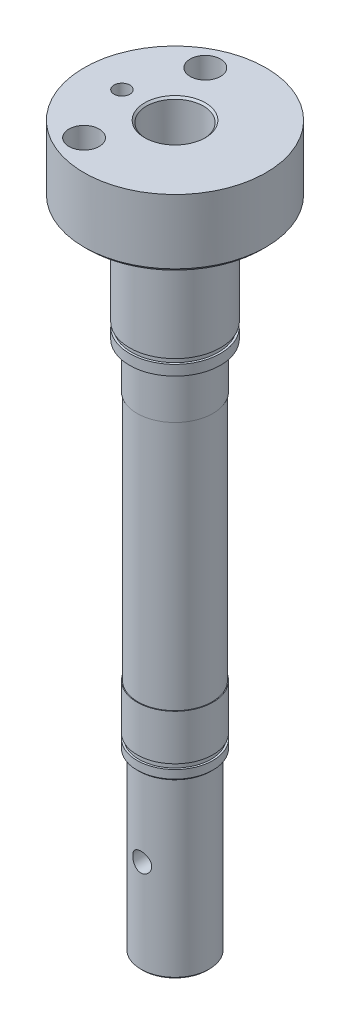
ISO-10303-21;
HEADER;
FILE_DESCRIPTION(('STEP AP214'),'2;1');
FILE_NAME('part.step','',(''),(''),'','','');
FILE_SCHEMA(('AUTOMOTIVE_DESIGN { 1 0 10303 214 1 1 1 1 }'));
ENDSEC;
DATA;
#1=APPLICATION_CONTEXT('core data for automotive mechanical design processes');
#2=APPLICATION_PROTOCOL_DEFINITION('international standard','automotive_design',2000,#1);
#3=PRODUCT_CONTEXT('',#1,'mechanical');
#4=PRODUCT('Part','Part','',(#3));
#5=PRODUCT_RELATED_PRODUCT_CATEGORY('part','',(#4));
#6=PRODUCT_DEFINITION_FORMATION('','',#4);
#7=PRODUCT_DEFINITION_CONTEXT('part definition',#1,'design');
#8=PRODUCT_DEFINITION('design','',#6,#7);
#9=PRODUCT_DEFINITION_SHAPE('','',#8);
#10=(LENGTH_UNIT() NAMED_UNIT(*) SI_UNIT(.MILLI.,.METRE.));
#11=(NAMED_UNIT(*) PLANE_ANGLE_UNIT() SI_UNIT($,.RADIAN.));
#12=(NAMED_UNIT(*) SI_UNIT($,.STERADIAN.) SOLID_ANGLE_UNIT());
#13=UNCERTAINTY_MEASURE_WITH_UNIT(LENGTH_MEASURE(1.E-05),#10,'distance_accuracy_value','');
#14=(GEOMETRIC_REPRESENTATION_CONTEXT(3) GLOBAL_UNCERTAINTY_ASSIGNED_CONTEXT((#13)) GLOBAL_UNIT_ASSIGNED_CONTEXT((#10,
#11,#12)) REPRESENTATION_CONTEXT('',''));
#15=CARTESIAN_POINT('',(0.,0.,0.));
#16=DIRECTION('',(0.,0.,1.));
#17=DIRECTION('',(1.,0.,0.));
#18=AXIS2_PLACEMENT_3D('',#15,#16,#17);
#19=CARTESIAN_POINT('',(0.,0.,0.));
#20=DIRECTION('',(0.,-1.,0.));
#21=DIRECTION('',(0.,0.,-1.));
#22=AXIS2_PLACEMENT_3D('',#19,#20,#21);
#23=CYLINDRICAL_SURFACE('',#22,9.99999999999998);
#24=CARTESIAN_POINT('',(0.,50.,0.));
#25=DIRECTION('',(0.,-1.,0.));
#26=DIRECTION('',(0.,0.,-1.));
#27=AXIS2_PLACEMENT_3D('',#24,#25,#26);
#28=CIRCLE('',#27,10.);
#29=CARTESIAN_POINT('',(0.,50.,-10.));
#30=VERTEX_POINT('',#29);
#31=EDGE_CURVE('E129',#30,#30,#28,.T.);
#32=ORIENTED_EDGE('',*,*,#31,.F.);
#33=EDGE_LOOP('',(#32));
#34=FACE_BOUND('',#33,.T.);
#35=CARTESIAN_POINT('',(0.,62.,0.));
#36=DIRECTION('',(0.,-1.,0.));
#37=DIRECTION('',(0.,0.,-1.));
#38=AXIS2_PLACEMENT_3D('',#35,#36,#37);
#39=CIRCLE('',#38,9.99999999999998);
#40=CARTESIAN_POINT('',(0.,62.,-9.99999999999998));
#41=VERTEX_POINT('',#40);
#42=EDGE_CURVE('E147',#41,#41,#39,.T.);
#43=ORIENTED_EDGE('',*,*,#42,.T.);
#44=EDGE_LOOP('',(#43));
#45=FACE_BOUND('',#44,.T.);
#46=ADVANCED_FACE('F36',(#34,#45),#23,.T.);
#47=CARTESIAN_POINT('',(0.,0.,0.));
#48=DIRECTION('',(0.,-1.,0.));
#49=DIRECTION('',(0.,0.,-1.));
#50=AXIS2_PLACEMENT_3D('',#47,#48,#49);
#51=CYLINDRICAL_SURFACE('',#50,12.);
#52=CARTESIAN_POINT('',(0.,140.,0.));
#53=DIRECTION('',(0.,-1.,0.));
#54=DIRECTION('',(0.,0.,-1.));
#55=AXIS2_PLACEMENT_3D('',#52,#53,#54);
#56=CIRCLE('',#55,12.);
#57=CARTESIAN_POINT('',(-11.9853571428572,140.,-0.592633240852343));
#58=VERTEX_POINT('',#57);
#59=CARTESIAN_POINT('',(-11.9853571428572,140.,0.592633240852342));
#60=VERTEX_POINT('',#59);
#61=EDGE_CURVE('E162',#58,#60,#56,.T.);
#62=ORIENTED_EDGE('',*,*,#61,.F.);
#63=DIRECTION('',(0.,1.,0.));
#64=VECTOR('',#63,1.);
#65=CARTESIAN_POINT('',(-11.9853571428572,141.35,-0.592633240852343));
#66=LINE('',#65,#64);
#67=CARTESIAN_POINT('',(-11.9853571428571,142.7,-0.592633240852343));
#68=VERTEX_POINT('',#67);
#69=EDGE_CURVE('E100',#58,#68,#66,.T.);
#70=ORIENTED_EDGE('',*,*,#69,.T.);
#71=CARTESIAN_POINT('',(0.,142.7,0.));
#72=DIRECTION('',(0.,-1.,0.));
#73=DIRECTION('',(0.,0.,-1.));
#74=AXIS2_PLACEMENT_3D('',#71,#72,#73);
#75=CIRCLE('',#74,12.);
#76=CARTESIAN_POINT('',(-11.9853571428571,142.7,0.592633240852343));
#77=VERTEX_POINT('',#76);
#78=EDGE_CURVE('E141',#68,#77,#75,.T.);
#79=ORIENTED_EDGE('',*,*,#78,.T.);
#80=DIRECTION('',(0.,1.,0.));
#81=VECTOR('',#80,1.);
#82=CARTESIAN_POINT('',(-11.9853571428572,141.35,0.592633240852342));
#83=LINE('',#82,#81);
#84=EDGE_CURVE('E51',#77,#60,#83,.F.);
#85=ORIENTED_EDGE('',*,*,#84,.T.);
#86=EDGE_LOOP('',(#62,#70,#79,#85));
#87=FACE_BOUND('',#86,.T.);
#88=ADVANCED_FACE('F234',(#87),#51,.T.);
#89=CARTESIAN_POINT('',(12.,140.,0.));
#90=DIRECTION('',(0.,1.,0.));
#91=DIRECTION('',(0.,0.,1.));
#92=AXIS2_PLACEMENT_3D('',#89,#90,#91);
#93=PLANE('',#92);
#94=CARTESIAN_POINT('',(0.,140.,0.));
#95=DIRECTION('',(0.,-1.,0.));
#96=DIRECTION('',(0.,0.,-1.));
#97=AXIS2_PLACEMENT_3D('',#94,#95,#96);
#98=CIRCLE('',#97,9.99999999999999);
#99=CARTESIAN_POINT('',(0.,140.,-9.99999999999999));
#100=VERTEX_POINT('',#99);
#101=EDGE_CURVE('E159',#100,#100,#98,.T.);
#102=ORIENTED_EDGE('',*,*,#101,.F.);
#103=EDGE_LOOP('',(#102));
#104=FACE_BOUND('',#103,.T.);
#105=ORIENTED_EDGE('',*,*,#61,.T.);
#106=CARTESIAN_POINT('',(-14.,140.,0.));
#107=DIRECTION('',(0.,1.,0.));
#108=DIRECTION('',(0.,0.,1.));
#109=AXIS2_PLACEMENT_3D('',#106,#107,#108);
#110=CIRCLE('',#109,2.09999999999997);
#111=EDGE_CURVE('E103',#60,#58,#110,.T.);
#112=ORIENTED_EDGE('',*,*,#111,.T.);
#113=EDGE_LOOP('',(#105,#112));
#114=FACE_BOUND('',#113,.T.);
#115=ADVANCED_FACE('F240',(#104,#114),#93,.F.);
#116=CARTESIAN_POINT('',(0.,0.,0.));
#117=DIRECTION('',(0.,-1.,0.));
#118=DIRECTION('',(0.,0.,-1.));
#119=AXIS2_PLACEMENT_3D('',#116,#117,#118);
#120=CYLINDRICAL_SURFACE('',#119,9.99999999999999);
#121=CARTESIAN_POINT('',(0.,128.,0.));
#122=DIRECTION('',(0.,-1.,0.));
#123=DIRECTION('',(0.,0.,-1.));
#124=AXIS2_PLACEMENT_3D('',#121,#122,#123);
#125=CIRCLE('',#124,9.99999999999999);
#126=CARTESIAN_POINT('',(0.,128.,-9.99999999999999));
#127=VERTEX_POINT('',#126);
#128=EDGE_CURVE('E156',#127,#127,#125,.T.);
#129=ORIENTED_EDGE('',*,*,#128,.F.);
#130=EDGE_LOOP('',(#129));
#131=FACE_BOUND('',#130,.T.);
#132=ORIENTED_EDGE('',*,*,#101,.T.);
#133=EDGE_LOOP('',(#132));
#134=FACE_BOUND('',#133,.T.);
#135=ADVANCED_FACE('F393',(#131,#134),#120,.T.);
#136=CARTESIAN_POINT('',(9.99999999999999,128.,0.));
#137=DIRECTION('',(0.,1.,0.));
#138=DIRECTION('',(0.,0.,1.));
#139=AXIS2_PLACEMENT_3D('',#136,#137,#138);
#140=PLANE('',#139);
#141=CARTESIAN_POINT('',(0.,128.,0.));
#142=DIRECTION('',(0.,-1.,0.));
#143=DIRECTION('',(0.,0.,-1.));
#144=AXIS2_PLACEMENT_3D('',#141,#142,#143);
#145=CIRCLE('',#144,9.79999999999999);
#146=CARTESIAN_POINT('',(0.,128.,-9.79999999999999));
#147=VERTEX_POINT('',#146);
#148=EDGE_CURVE('E153',#147,#147,#145,.T.);
#149=ORIENTED_EDGE('',*,*,#148,.F.);
#150=EDGE_LOOP('',(#149));
#151=FACE_BOUND('',#150,.T.);
#152=ORIENTED_EDGE('',*,*,#128,.T.);
#153=EDGE_LOOP('',(#152));
#154=FACE_BOUND('',#153,.T.);
#155=ADVANCED_FACE('F383',(#151,#154),#140,.F.);
#156=CARTESIAN_POINT('',(0.,0.,0.));
#157=DIRECTION('',(0.,-1.,0.));
#158=DIRECTION('',(0.,0.,-1.));
#159=AXIS2_PLACEMENT_3D('',#156,#157,#158);
#160=CYLINDRICAL_SURFACE('',#159,9.79999999999999);
#161=CARTESIAN_POINT('',(0.,62.,0.));
#162=DIRECTION('',(0.,-1.,0.));
#163=DIRECTION('',(0.,0.,-1.));
#164=AXIS2_PLACEMENT_3D('',#161,#162,#163);
#165=CIRCLE('',#164,9.79999999999998);
#166=CARTESIAN_POINT('',(0.,62.,-9.79999999999998));
#167=VERTEX_POINT('',#166);
#168=EDGE_CURVE('E150',#167,#167,#165,.T.);
#169=ORIENTED_EDGE('',*,*,#168,.F.);
#170=EDGE_LOOP('',(#169));
#171=FACE_BOUND('',#170,.T.);
#172=ORIENTED_EDGE('',*,*,#148,.T.);
#173=EDGE_LOOP('',(#172));
#174=FACE_BOUND('',#173,.T.);
#175=ADVANCED_FACE('F375',(#171,#174),#160,.T.);
#176=CARTESIAN_POINT('',(9.79999999999998,62.,0.));
#177=DIRECTION('',(0.,-1.,0.));
#178=DIRECTION('',(0.,0.,-1.));
#179=AXIS2_PLACEMENT_3D('',#176,#177,#178);
#180=PLANE('',#179);
#181=ORIENTED_EDGE('',*,*,#42,.F.);
#182=EDGE_LOOP('',(#181));
#183=FACE_BOUND('',#182,.T.);
#184=ORIENTED_EDGE('',*,*,#168,.T.);
#185=EDGE_LOOP('',(#184));
#186=FACE_BOUND('',#185,.T.);
#187=ADVANCED_FACE('F223',(#183,#186),#180,.F.);
#188=CARTESIAN_POINT('',(12.,142.7,0.));
#189=DIRECTION('',(0.,1.,0.));
#190=DIRECTION('',(0.,0.,1.));
#191=AXIS2_PLACEMENT_3D('',#188,#189,#190);
#192=PLANE('',#191);
#193=CARTESIAN_POINT('',(-14.,142.7,0.));
#194=DIRECTION('',(0.,1.,0.));
#195=DIRECTION('',(0.,0.,1.));
#196=AXIS2_PLACEMENT_3D('',#193,#194,#195);
#197=CIRCLE('',#196,2.09999999999997);
#198=EDGE_CURVE('E97',#77,#68,#197,.T.);
#199=ORIENTED_EDGE('',*,*,#198,.F.);
#200=ORIENTED_EDGE('',*,*,#78,.F.);
#201=EDGE_LOOP('',(#199,#200));
#202=FACE_BOUND('',#201,.T.);
#203=CARTESIAN_POINT('',(0.,142.7,0.));
#204=DIRECTION('',(0.,-1.,0.));
#205=DIRECTION('',(0.,0.,-1.));
#206=AXIS2_PLACEMENT_3D('',#203,#204,#205);
#207=CIRCLE('',#206,11.45);
#208=CARTESIAN_POINT('',(0.,142.7,-11.45));
#209=VERTEX_POINT('',#208);
#210=EDGE_CURVE('E138',#209,#209,#207,.T.);
#211=ORIENTED_EDGE('',*,*,#210,.T.);
#212=EDGE_LOOP('',(#211));
#213=FACE_BOUND('',#212,.T.);
#214=ADVANCED_FACE('F220',(#202,#213),#192,.T.);
#215=CARTESIAN_POINT('',(0.,0.,0.));
#216=DIRECTION('',(0.,-1.,0.));
#217=DIRECTION('',(0.,0.,-1.));
#218=AXIS2_PLACEMENT_3D('',#215,#216,#217);
#219=CYLINDRICAL_SURFACE('',#218,11.45);
#220=ORIENTED_EDGE('',*,*,#210,.F.);
#221=EDGE_LOOP('',(#220));
#222=FACE_BOUND('',#221,.T.);
#223=CARTESIAN_POINT('',(0.,144.,0.));
#224=DIRECTION('',(0.,-1.,0.));
#225=DIRECTION('',(0.,0.,-1.));
#226=AXIS2_PLACEMENT_3D('',#223,#224,#225);
#227=CIRCLE('',#226,11.45);
#228=CARTESIAN_POINT('',(0.,144.,-11.45));
#229=VERTEX_POINT('',#228);
#230=EDGE_CURVE('E135',#229,#229,#227,.T.);
#231=ORIENTED_EDGE('',*,*,#230,.T.);
#232=EDGE_LOOP('',(#231));
#233=FACE_BOUND('',#232,.T.);
#234=ADVANCED_FACE('F216',(#222,#233),#219,.T.);
#235=CARTESIAN_POINT('',(11.45,144.,0.));
#236=DIRECTION('',(0.,-1.,0.));
#237=DIRECTION('',(0.,0.,-1.));
#238=AXIS2_PLACEMENT_3D('',#235,#236,#237);
#239=PLANE('',#238);
#240=CARTESIAN_POINT('',(-14.,144.,0.));
#241=DIRECTION('',(0.,-1.,0.));
#242=DIRECTION('',(0.,0.,-1.));
#243=AXIS2_PLACEMENT_3D('',#240,#241,#242);
#244=CIRCLE('',#243,2.09999999999997);
#245=CARTESIAN_POINT('',(-11.9853571428571,144.,-0.592633240852343));
#246=VERTEX_POINT('',#245);
#247=CARTESIAN_POINT('',(-11.9853571428571,144.,0.592633240852342));
#248=VERTEX_POINT('',#247);
#249=EDGE_CURVE('E59',#246,#248,#244,.T.);
#250=ORIENTED_EDGE('',*,*,#249,.F.);
#251=CARTESIAN_POINT('',(0.,144.,0.));
#252=DIRECTION('',(0.,-1.,0.));
#253=DIRECTION('',(0.,0.,-1.));
#254=AXIS2_PLACEMENT_3D('',#251,#252,#253);
#255=CIRCLE('',#254,12.);
#256=EDGE_CURVE('E132',#246,#248,#255,.T.);
#257=ORIENTED_EDGE('',*,*,#256,.T.);
#258=EDGE_LOOP('',(#250,#257));
#259=FACE_BOUND('',#258,.T.);
#260=ORIENTED_EDGE('',*,*,#230,.F.);
#261=EDGE_LOOP('',(#260));
#262=FACE_BOUND('',#261,.T.);
#263=ADVANCED_FACE('F213',(#259,#262),#239,.T.);
#264=CARTESIAN_POINT('',(0.,190.,0.));
#265=DIRECTION('',(0.,-1.,0.));
#266=DIRECTION('',(0.,0.,-1.));
#267=AXIS2_PLACEMENT_3D('',#264,#265,#266);
#268=PLANE('',#267);
#269=CARTESIAN_POINT('',(0.,190.,0.));
#270=DIRECTION('',(0.,-1.,0.));
#271=DIRECTION('',(0.,0.,-1.));
#272=AXIS2_PLACEMENT_3D('',#269,#270,#271);
#273=CIRCLE('',#272,8.);
#274=CARTESIAN_POINT('',(0.,190.,-8.));
#275=VERTEX_POINT('',#274);
#276=EDGE_CURVE('E11',#275,#275,#273,.T.);
#277=ORIENTED_EDGE('',*,*,#276,.T.);
#278=EDGE_LOOP('',(#277));
#279=FACE_BOUND('',#278,.T.);
#280=CARTESIAN_POINT('',(-14.,190.,0.));
#281=DIRECTION('',(0.,1.,0.));
#282=DIRECTION('',(0.,0.,1.));
#283=AXIS2_PLACEMENT_3D('',#280,#281,#282);
#284=CIRCLE('',#283,2.09999999999998);
#285=CARTESIAN_POINT('',(-14.,190.,2.09999999999998));
#286=VERTEX_POINT('',#285);
#287=EDGE_CURVE('E88',#286,#286,#284,.T.);
#288=ORIENTED_EDGE('',*,*,#287,.F.);
#289=EDGE_LOOP('',(#288));
#290=FACE_BOUND('',#289,.T.);
#291=CARTESIAN_POINT('',(-8.,190.,16.));
#292=DIRECTION('',(0.,1.,0.));
#293=DIRECTION('',(0.,0.,1.));
#294=AXIS2_PLACEMENT_3D('',#291,#292,#293);
#295=CIRCLE('',#294,4.);
#296=CARTESIAN_POINT('',(-8.,190.,20.));
#297=VERTEX_POINT('',#296);
#298=EDGE_CURVE('E106',#297,#297,#295,.T.);
#299=ORIENTED_EDGE('',*,*,#298,.F.);
#300=EDGE_LOOP('',(#299));
#301=FACE_BOUND('',#300,.T.);
#302=CARTESIAN_POINT('',(-8.,190.,-16.));
#303=DIRECTION('',(0.,1.,0.));
#304=DIRECTION('',(0.,0.,1.));
#305=AXIS2_PLACEMENT_3D('',#302,#303,#304);
#306=CIRCLE('',#305,4.);
#307=CARTESIAN_POINT('',(-8.,190.,-12.));
#308=VERTEX_POINT('',#307);
#309=EDGE_CURVE('E113',#308,#308,#306,.T.);
#310=ORIENTED_EDGE('',*,*,#309,.F.);
#311=EDGE_LOOP('',(#310));
#312=FACE_BOUND('',#311,.T.);
#313=CARTESIAN_POINT('',(0.,190.,0.));
#314=DIRECTION('',(0.,-1.,0.));
#315=DIRECTION('',(0.,0.,-1.));
#316=AXIS2_PLACEMENT_3D('',#313,#314,#315);
#317=CIRCLE('',#316,24.);
#318=CARTESIAN_POINT('',(0.,190.,-24.));
#319=VERTEX_POINT('',#318);
#320=EDGE_CURVE('E168',#319,#319,#317,.T.);
#321=ORIENTED_EDGE('',*,*,#320,.F.);
#322=EDGE_LOOP('',(#321));
#323=FACE_BOUND('',#322,.T.);
#324=ADVANCED_FACE('F38',(#279,#290,#301,#312,#323),#268,.F.);
#325=CARTESIAN_POINT('',(0.,0.,0.));
#326=DIRECTION('',(0.,-1.,0.));
#327=DIRECTION('',(0.,0.,-1.));
#328=AXIS2_PLACEMENT_3D('',#325,#326,#327);
#329=CYLINDRICAL_SURFACE('',#328,24.);
#330=CARTESIAN_POINT('',(0.,173.,0.));
#331=DIRECTION('',(0.,1.,0.));
#332=DIRECTION('',(0.,0.,1.));
#333=AXIS2_PLACEMENT_3D('',#330,#331,#332);
#334=CIRCLE('',#333,24.);
#335=CARTESIAN_POINT('',(0.,173.,24.));
#336=VERTEX_POINT('',#335);
#337=EDGE_CURVE('E265',#336,#336,#334,.T.);
#338=ORIENTED_EDGE('',*,*,#337,.T.);
#339=EDGE_LOOP('',(#338));
#340=FACE_BOUND('',#339,.T.);
#341=ORIENTED_EDGE('',*,*,#320,.T.);
#342=EDGE_LOOP('',(#341));
#343=FACE_BOUND('',#342,.T.);
#344=ADVANCED_FACE('F421',(#340,#343),#329,.T.);
#345=CARTESIAN_POINT('',(24.,172.,0.));
#346=DIRECTION('',(0.,1.,0.));
#347=DIRECTION('',(0.,0.,1.));
#348=AXIS2_PLACEMENT_3D('',#345,#346,#347);
#349=PLANE('',#348);
#350=CARTESIAN_POINT('',(-8.,172.,16.));
#351=DIRECTION('',(0.,1.,0.));
#352=DIRECTION('',(0.,0.,1.));
#353=AXIS2_PLACEMENT_3D('',#350,#351,#352);
#354=CIRCLE('',#353,4.);
#355=CARTESIAN_POINT('',(-8.,172.,20.));
#356=VERTEX_POINT('',#355);
#357=EDGE_CURVE('E109',#356,#356,#354,.F.);
#358=ORIENTED_EDGE('',*,*,#357,.F.);
#359=EDGE_LOOP('',(#358));
#360=FACE_BOUND('',#359,.T.);
#361=CARTESIAN_POINT('',(0.,172.,0.));
#362=DIRECTION('',(0.,1.,0.));
#363=DIRECTION('',(0.,0.,1.));
#364=AXIS2_PLACEMENT_3D('',#361,#362,#363);
#365=CIRCLE('',#364,23.);
#366=CARTESIAN_POINT('',(0.,172.,23.));
#367=VERTEX_POINT('',#366);
#368=EDGE_CURVE('E261',#367,#367,#365,.F.);
#369=ORIENTED_EDGE('',*,*,#368,.T.);
#370=EDGE_LOOP('',(#369));
#371=FACE_BOUND('',#370,.T.);
#372=CARTESIAN_POINT('',(-8.,172.,-16.));
#373=DIRECTION('',(0.,1.,0.));
#374=DIRECTION('',(0.,0.,1.));
#375=AXIS2_PLACEMENT_3D('',#372,#373,#374);
#376=CIRCLE('',#375,4.);
#377=CARTESIAN_POINT('',(-8.,172.,-12.));
#378=VERTEX_POINT('',#377);
#379=EDGE_CURVE('E116',#378,#378,#376,.F.);
#380=ORIENTED_EDGE('',*,*,#379,.F.);
#381=EDGE_LOOP('',(#380));
#382=FACE_BOUND('',#381,.T.);
#383=CARTESIAN_POINT('',(0.,172.,0.));
#384=DIRECTION('',(0.,-1.,0.));
#385=DIRECTION('',(0.,0.,-1.));
#386=AXIS2_PLACEMENT_3D('',#383,#384,#385);
#387=CIRCLE('',#386,12.);
#388=CARTESIAN_POINT('',(-11.9853571428572,172.,-0.592633240852366));
#389=VERTEX_POINT('',#388);
#390=CARTESIAN_POINT('',(-11.9853571428572,172.,0.592633240852342));
#391=VERTEX_POINT('',#390);
#392=EDGE_CURVE('E165',#389,#391,#387,.T.);
#393=ORIENTED_EDGE('',*,*,#392,.F.);
#394=CARTESIAN_POINT('',(-14.,172.,0.));
#395=DIRECTION('',(0.,1.,0.));
#396=DIRECTION('',(0.,0.,1.));
#397=AXIS2_PLACEMENT_3D('',#394,#395,#396);
#398=CIRCLE('',#397,2.09999999999997);
#399=EDGE_CURVE('E91',#389,#391,#398,.T.);
#400=ORIENTED_EDGE('',*,*,#399,.T.);
#401=EDGE_LOOP('',(#393,#400));
#402=FACE_BOUND('',#401,.T.);
#403=ADVANCED_FACE('F415',(#360,#371,#382,#402),#349,.F.);
#404=ORIENTED_EDGE('',*,*,#256,.F.);
#405=DIRECTION('',(0.,1.,0.));
#406=VECTOR('',#405,1.);
#407=CARTESIAN_POINT('',(-11.9853571428572,95.,-0.592633240852343));
#408=LINE('',#407,#406);
#409=EDGE_CURVE('E276',#246,#389,#408,.T.);
#410=ORIENTED_EDGE('',*,*,#409,.T.);
#411=ORIENTED_EDGE('',*,*,#392,.T.);
#412=DIRECTION('',(0.,1.,0.));
#413=VECTOR('',#412,1.);
#414=CARTESIAN_POINT('',(-11.9853571428572,95.,0.592633240852342));
#415=LINE('',#414,#413);
#416=EDGE_CURVE('E274',#391,#248,#415,.F.);
#417=ORIENTED_EDGE('',*,*,#416,.T.);
#418=EDGE_LOOP('',(#404,#410,#411,#417));
#419=FACE_BOUND('',#418,.T.);
#420=ADVANCED_FACE('F211',(#419),#51,.T.);
#421=CARTESIAN_POINT('',(10.,50.,0.));
#422=DIRECTION('',(0.,1.,0.));
#423=DIRECTION('',(0.,0.,1.));
#424=AXIS2_PLACEMENT_3D('',#421,#422,#423);
#425=PLANE('',#424);
#426=CARTESIAN_POINT('',(0.,50.,0.));
#427=DIRECTION('',(0.,-1.,0.));
#428=DIRECTION('',(0.,0.,-1.));
#429=AXIS2_PLACEMENT_3D('',#426,#427,#428);
#430=CIRCLE('',#429,9.5);
#431=CARTESIAN_POINT('',(0.,50.,-9.5));
#432=VERTEX_POINT('',#431);
#433=EDGE_CURVE('E126',#432,#432,#430,.T.);
#434=ORIENTED_EDGE('',*,*,#433,.F.);
#435=EDGE_LOOP('',(#434));
#436=FACE_BOUND('',#435,.T.);
#437=ORIENTED_EDGE('',*,*,#31,.T.);
#438=EDGE_LOOP('',(#437));
#439=FACE_BOUND('',#438,.T.);
#440=ADVANCED_FACE('F207',(#436,#439),#425,.F.);
#441=CARTESIAN_POINT('',(0.,0.,0.));
#442=DIRECTION('',(0.,-1.,0.));
#443=DIRECTION('',(0.,0.,-1.));
#444=AXIS2_PLACEMENT_3D('',#441,#442,#443);
#445=CYLINDRICAL_SURFACE('',#444,9.5);
#446=ORIENTED_EDGE('',*,*,#433,.T.);
#447=EDGE_LOOP('',(#446));
#448=FACE_BOUND('',#447,.T.);
#449=CARTESIAN_POINT('',(0.,48.7,0.));
#450=DIRECTION('',(0.,-1.,0.));
#451=DIRECTION('',(0.,0.,-1.));
#452=AXIS2_PLACEMENT_3D('',#449,#450,#451);
#453=CIRCLE('',#452,9.5);
#454=CARTESIAN_POINT('',(0.,48.7,-9.5));
#455=VERTEX_POINT('',#454);
#456=EDGE_CURVE('E123',#455,#455,#453,.T.);
#457=ORIENTED_EDGE('',*,*,#456,.F.);
#458=EDGE_LOOP('',(#457));
#459=FACE_BOUND('',#458,.T.);
#460=ADVANCED_FACE('F203',(#448,#459),#445,.T.);
#461=CARTESIAN_POINT('',(9.5,48.7,0.));
#462=DIRECTION('',(0.,-1.,0.));
#463=DIRECTION('',(0.,0.,-1.));
#464=AXIS2_PLACEMENT_3D('',#461,#462,#463);
#465=PLANE('',#464);
#466=CARTESIAN_POINT('',(0.,48.7,0.));
#467=DIRECTION('',(0.,-1.,0.));
#468=DIRECTION('',(0.,0.,-1.));
#469=AXIS2_PLACEMENT_3D('',#466,#467,#468);
#470=CIRCLE('',#469,10.);
#471=CARTESIAN_POINT('',(0.,48.7,-10.));
#472=VERTEX_POINT('',#471);
#473=EDGE_CURVE('E120',#472,#472,#470,.T.);
#474=ORIENTED_EDGE('',*,*,#473,.F.);
#475=EDGE_LOOP('',(#474));
#476=FACE_BOUND('',#475,.T.);
#477=ORIENTED_EDGE('',*,*,#456,.T.);
#478=EDGE_LOOP('',(#477));
#479=FACE_BOUND('',#478,.T.);
#480=ADVANCED_FACE('F199',(#476,#479),#465,.F.);
#481=CARTESIAN_POINT('',(8.99999999999998,0.,0.));
#482=DIRECTION('',(0.,1.,0.));
#483=DIRECTION('',(0.,0.,1.));
#484=AXIS2_PLACEMENT_3D('',#481,#482,#483);
#485=PLANE('',#484);
#486=CARTESIAN_POINT('',(0.,0.,0.));
#487=DIRECTION('',(0.,1.,0.));
#488=DIRECTION('',(0.,0.,1.));
#489=AXIS2_PLACEMENT_3D('',#486,#487,#488);
#490=CIRCLE('',#489,8.49999999999997);
#491=CARTESIAN_POINT('',(0.,0.,8.49999999999997));
#492=VERTEX_POINT('',#491);
#493=EDGE_CURVE('E171',#492,#492,#490,.F.);
#494=ORIENTED_EDGE('',*,*,#493,.T.);
#495=EDGE_LOOP('',(#494));
#496=FACE_BOUND('',#495,.T.);
#497=ADVANCED_FACE('F202',(#496),#485,.F.);
#498=CARTESIAN_POINT('',(0.,0.,0.));
#499=DIRECTION('',(0.,-1.,0.));
#500=DIRECTION('',(0.,0.,-1.));
#501=AXIS2_PLACEMENT_3D('',#498,#499,#500);
#502=CYLINDRICAL_SURFACE('',#501,8.99999999999998);
#503=CARTESIAN_POINT('',(0.,0.500000000000004,0.));
#504=DIRECTION('',(0.,1.,0.));
#505=DIRECTION('',(0.,0.,1.));
#506=AXIS2_PLACEMENT_3D('',#503,#504,#505);
#507=CIRCLE('',#506,8.99999999999998);
#508=CARTESIAN_POINT('',(0.,0.500000000000004,8.99999999999998));
#509=VERTEX_POINT('',#508);
#510=EDGE_CURVE('E268',#509,#509,#507,.T.);
#511=ORIENTED_EDGE('',*,*,#510,.T.);
#512=EDGE_LOOP('',(#511));
#513=FACE_BOUND('',#512,.T.);
#514=CARTESIAN_POINT('',(0.,27.5,-8.99999999999998));
#515=CARTESIAN_POINT('',(-0.137602501766358,27.4999972008296,-8.99999816033856));
#516=CARTESIAN_POINT('',(-0.275234247505334,27.4886013603894,-8.99681348173658));
#517=CARTESIAN_POINT('',(-0.546518951988477,27.4434085434694,-8.98441900396475));
#518=CARTESIAN_POINT('',(-0.680170207326879,27.4096021165726,-8.97520666298522));
#519=CARTESIAN_POINT('',(-0.939539899360602,27.3207825611722,-8.95177130789169));
#520=CARTESIAN_POINT('',(-1.06526878019134,27.2657980626032,-8.93755506061858));
#521=CARTESIAN_POINT('',(-1.30572139048355,27.1362929873463,-8.90560625164056));
#522=CARTESIAN_POINT('',(-1.4204441416246,27.0617706761614,-8.88787337777623));
#523=CARTESIAN_POINT('',(-1.63849356943184,26.8933411323144,-8.85030315634722));
#524=CARTESIAN_POINT('',(-1.7415062256169,26.7990359206252,-8.83042747246428));
#525=CARTESIAN_POINT('',(-1.93047637139272,26.5945674457565,-8.7910521423547));
#526=CARTESIAN_POINT('',(-2.01643146169124,26.4844019554483,-8.77155254937622));
#527=CARTESIAN_POINT('',(-2.17041617160631,26.2487854797426,-8.73474088585434));
#528=CARTESIAN_POINT('',(-2.23807749895613,26.1230855831171,-8.71747695878197));
#529=CARTESIAN_POINT('',(-2.35117914262341,25.8615361647152,-8.68765801630371));
#530=CARTESIAN_POINT('',(-2.39662394672714,25.7256886991666,-8.67510204999897));
#531=CARTESIAN_POINT('',(-2.46289848736025,25.4511944222944,-8.65651766235505));
#532=CARTESIAN_POINT('',(-2.48430073808206,25.3126963567531,-8.65033771821208));
#533=CARTESIAN_POINT('',(-2.50366854155516,25.0339482289146,-8.64475298585198));
#534=CARTESIAN_POINT('',(-2.50163888054626,24.8936985302551,-8.64534681401296));
#535=CARTESIAN_POINT('',(-2.4746534267536,24.6199554425519,-8.6531073365012));
#536=CARTESIAN_POINT('',(-2.45039804541374,24.4863863970069,-8.66007321349826));
#537=CARTESIAN_POINT('',(-2.38077462403778,24.2252927428175,-8.67947034094291));
#538=CARTESIAN_POINT('',(-2.33540476914306,24.0977686547957,-8.69190206119267));
#539=CARTESIAN_POINT('',(-2.22428746268939,23.8505955370893,-8.72100139554954));
#540=CARTESIAN_POINT('',(-2.15830043673984,23.7310602663798,-8.73771837201318));
#541=CARTESIAN_POINT('',(-2.00798881359268,23.5045168488176,-8.77347901367671));
#542=CARTESIAN_POINT('',(-1.9236603325812,23.3975113625477,-8.79252317128377));
#543=CARTESIAN_POINT('',(-1.73551122056889,23.1950722391272,-8.83162144253914));
#544=CARTESIAN_POINT('',(-1.63110455940471,23.1001847302403,-8.8516874007565));
#545=CARTESIAN_POINT('',(-1.40761321440207,22.9291485384444,-8.88996399621585));
#546=CARTESIAN_POINT('',(-1.28852785084393,22.8530007237951,-8.90817454746902));
#547=CARTESIAN_POINT('',(-1.03816685867623,22.7213363687399,-8.94081679425527));
#548=CARTESIAN_POINT('',(-0.906832791495496,22.6659257921222,-8.95522897291066));
#549=CARTESIAN_POINT('',(-0.636219977539429,22.5781318031173,-8.97850985002885));
#550=CARTESIAN_POINT('',(-0.496943128242261,22.5457429156869,-8.98737986647397));
#551=CARTESIAN_POINT('',(-0.219053215426284,22.5057857264421,-8.99837472966814));
#552=CARTESIAN_POINT('',(-0.0805546117173633,22.4974757101857,-9.00070107648054));
#553=CARTESIAN_POINT('',(0.195859861273135,22.5038539965849,-8.9989296058632));
#554=CARTESIAN_POINT('',(0.33377579456904,22.5185397032961,-8.99483251356348));
#555=CARTESIAN_POINT('',(0.602413826941717,22.5698866682393,-8.9808053011804));
#556=CARTESIAN_POINT('',(0.73322257632772,22.606127890115,-8.97098674335104));
#557=CARTESIAN_POINT('',(0.986886236237454,22.6990637352762,-8.9466365833876));
#558=CARTESIAN_POINT('',(1.10974024794481,22.7557606651392,-8.93210444977127));
#559=CARTESIAN_POINT('',(1.34684028081078,22.8893317560929,-8.8994748056814));
#560=CARTESIAN_POINT('',(1.4608541239069,22.9666010486448,-8.88130942680348));
#561=CARTESIAN_POINT('',(1.67455534117418,23.1386322716154,-8.84350954257202));
#562=CARTESIAN_POINT('',(1.77423962926343,23.2333979601334,-8.82387472213287));
#563=CARTESIAN_POINT('',(1.9596240538892,23.4412028877548,-8.78459685365755));
#564=CARTESIAN_POINT('',(2.04479915770501,23.5547149031079,-8.76497216404557));
#565=CARTESIAN_POINT('',(2.1949116285828,23.7948412757667,-8.72859386619892));
#566=CARTESIAN_POINT('',(2.25984976965913,23.9214551317123,-8.71184014816763));
#567=CARTESIAN_POINT('',(2.36716211667702,24.1836143397486,-8.68329597870043));
#568=CARTESIAN_POINT('',(2.40966154966511,24.3191052754281,-8.67147806034819));
#569=CARTESIAN_POINT('',(2.47115304987672,24.5956994187438,-8.65415753646736));
#570=CARTESIAN_POINT('',(2.49015175812551,24.7368010292315,-8.64865314684264));
#571=CARTESIAN_POINT('',(2.50369719949209,25.0152115590136,-8.6447407666506));
#572=CARTESIAN_POINT('',(2.49909142028599,25.1524763800691,-8.64608680814102));
#573=CARTESIAN_POINT('',(2.4675428657362,25.4241897876208,-8.65514273976247));
#574=CARTESIAN_POINT('',(2.4406007609873,25.5586384585411,-8.66285243883986));
#575=CARTESIAN_POINT('',(2.36565448497557,25.8197344678233,-8.6836143764982));
#576=CARTESIAN_POINT('',(2.31784429282322,25.9464416852921,-8.69661733835619));
#577=CARTESIAN_POINT('',(2.20266903341381,26.1901348450181,-8.72649832095032));
#578=CARTESIAN_POINT('',(2.13530066717352,26.3071191429723,-8.74337699532339));
#579=CARTESIAN_POINT('',(1.98041392404219,26.5320553056494,-8.77977621573301));
#580=CARTESIAN_POINT('',(1.8923241686926,26.6396029533652,-8.79936357965204));
#581=CARTESIAN_POINT('',(1.69956305490126,26.8386647441072,-8.8386166381804));
#582=CARTESIAN_POINT('',(1.59488759125637,26.930174905782,-8.85828235100434));
#583=CARTESIAN_POINT('',(1.36892046461578,27.0967162731561,-8.89603679163283));
#584=CARTESIAN_POINT('',(1.24729251786435,27.1713032466214,-8.91407682385631));
#585=CARTESIAN_POINT('',(0.992723965385678,27.298856278579,-8.94599949801157));
#586=CARTESIAN_POINT('',(0.859790060353449,27.3518350371621,-8.95988458070656));
#587=CARTESIAN_POINT('',(0.606290967533401,27.4284401614694,-8.98032149663909));
#588=CARTESIAN_POINT('',(0.486728804337482,27.4552095751858,-8.98764491323711));
#589=CARTESIAN_POINT('',(0.244785251386817,27.4909896916451,-8.99748469952565));
#590=CARTESIAN_POINT('',(0.12240419603883,27.5000024899999,-9.00000163646933));
#591=CARTESIAN_POINT('',(0.,27.5,-8.99999999999998));
#592=B_SPLINE_CURVE_WITH_KNOTS('',3,(#514,#515,#516,#517,#518,#519,#520,#521,#522,#523,#524,
#525,#526,#527,#528,#529,#530,#531,#532,#533,#534,#535,#536,#537,#538,#539,#540,#541,#542,#543,
#544,#545,#546,#547,#548,#549,#550,#551,#552,#553,#554,#555,#556,#557,#558,#559,#560,#561,#562,
#563,#564,#565,#566,#567,#568,#569,#570,#571,#572,#573,#574,#575,#576,#577,#578,#579,#580,#581,
#582,#583,#584,#585,#586,#587,#588,#589,#590,#591),.UNSPECIFIED.,.T.,.F.,(4,2,2,2,2,2,2,2,2,2,2,
2,2,2,2,2,2,2,2,2,2,2,2,2,2,2,2,2,2,2,2,2,2,2,2,2,2,2,4),(0.,0.412358386198981,
0.824890772294521,1.23686741588571,1.64888064567586,2.07015248650528,2.49148354087991,
2.92075380647344,3.34993732266768,3.76866863882698,4.18731442577046,4.593204659896,
4.99912978807063,5.40995920090068,5.82087569194106,6.2463898768508,6.67192377325048,
7.09960331280656,7.5271811070877,7.94144021185609,8.35565255505711,8.76204634963729,
9.16848598334834,9.58337897777209,9.99836119210685,10.4261198341446,10.8538621134516,
11.279191297197,11.7044002604958,12.114451985064,12.5244913992549,12.9307978713245,
13.3371729171665,13.7564382656794,14.1758075510164,14.6051618118986,15.0342633576383,
15.4011197307046,15.7679328052827),.UNSPECIFIED.);
#593=CARTESIAN_POINT('',(0.,27.5,-8.99999999999998));
#594=VERTEX_POINT('',#593);
#595=EDGE_CURVE('E117',#594,#594,#592,.T.);
#596=ORIENTED_EDGE('',*,*,#595,.T.);
#597=EDGE_LOOP('',(#596));
#598=FACE_BOUND('',#597,.T.);
#599=CARTESIAN_POINT('',(2.5,25.,8.64580823289527));
#600=CARTESIAN_POINT('',(2.49999714996617,24.8625130467101,8.64581037496084));
#601=CARTESIAN_POINT('',(2.48861977425243,24.7249967599269,8.64912360937157));
#602=CARTESIAN_POINT('',(2.44350693717148,24.4539514045688,8.66197474072457));
#603=CARTESIAN_POINT('',(2.40976148964065,24.3204241447223,8.67151541786229));
#604=CARTESIAN_POINT('',(2.32112008680785,24.0613176732405,8.69565935423005));
#605=CARTESIAN_POINT('',(2.26625559744293,23.9357269592463,8.71025507855492));
#606=CARTESIAN_POINT('',(2.13703377417484,23.6955090779446,8.74285475062131));
#607=CARTESIAN_POINT('',(2.06267446056935,23.5808830257146,8.76085904445195));
#608=CARTESIAN_POINT('',(1.89441531907552,23.3627381444172,8.79879482245343));
#609=CARTESIAN_POINT('',(1.80008077870936,23.2595608823638,8.81876275539877));
#610=CARTESIAN_POINT('',(1.59548286960028,23.0702691609607,8.85806239814545));
#611=CARTESIAN_POINT('',(1.48521773095722,22.984156600035,8.87739403696069));
#612=CARTESIAN_POINT('',(1.249500428906,22.8299955388388,8.91365202741971));
#613=CARTESIAN_POINT('',(1.12381632761083,22.7622894081556,8.93053038427287));
#614=CARTESIAN_POINT('',(0.862300362049425,22.6491007262403,8.95956018312962));
#615=CARTESIAN_POINT('',(0.726470365890894,22.603614095426,8.97171249276932));
#616=CARTESIAN_POINT('',(0.452086360205863,22.5372690545274,8.98966318340411));
#617=CARTESIAN_POINT('',(0.313682975067018,22.5158289577387,8.99561138050701));
#618=CARTESIAN_POINT('',(0.0351244568787297,22.496352543344,9.0010086738428));
#619=CARTESIAN_POINT('',(-0.105030354422775,22.4983119884433,9.00045894674932));
#620=CARTESIAN_POINT('',(-0.379054247152543,22.5251755523838,8.99303086374214));
#621=CARTESIAN_POINT('',(-0.512990410045096,22.5494507639691,8.98632598075259));
#622=CARTESIAN_POINT('',(-0.774807483322479,22.6192371382326,8.96754760099032));
#623=CARTESIAN_POINT('',(-0.902688034006087,22.6647495606551,8.95547378574643));
#624=CARTESIAN_POINT('',(-1.15033359179948,22.7761820805831,8.92706250606227));
#625=CARTESIAN_POINT('',(-1.26999902658788,22.8423119095243,8.91068150784284));
#626=CARTESIAN_POINT('',(-1.49674457308826,22.9929396158198,8.87541221350136));
#627=CARTESIAN_POINT('',(-1.60382204684013,23.077441332692,8.85652339359454));
#628=CARTESIAN_POINT('',(-1.80610676038229,23.2657286577773,8.81753663226072));
#629=CARTESIAN_POINT('',(-1.9008012505898,23.3700618056458,8.79741936953616));
#630=CARTESIAN_POINT('',(-2.07148108085113,23.5933326751222,8.75880383152744));
#631=CARTESIAN_POINT('',(-2.14746507027557,23.7122714501184,8.74030567318144));
#632=CARTESIAN_POINT('',(-2.27900238121953,23.9625647214123,8.70694013940653));
#633=CARTESIAN_POINT('',(-2.33440501640979,24.0940022693059,8.69209980055972));
#634=CARTESIAN_POINT('',(-2.42215297643582,24.3648435957585,8.66806022503137));
#635=CARTESIAN_POINT('',(-2.45450458459976,24.5042451922499,8.65885945119344));
#636=CARTESIAN_POINT('',(-2.49432455486229,24.7822345139979,8.64747148287151));
#637=CARTESIAN_POINT('',(-2.50256249342185,24.920703234809,8.64506746157858));
#638=CARTESIAN_POINT('',(-2.49605092061448,25.1970419904518,8.64694988564762));
#639=CARTESIAN_POINT('',(-2.48130409524808,25.3349120933501,8.65123554925279));
#640=CARTESIAN_POINT('',(-2.42992241428478,25.6030977466914,8.66580389953322));
#641=CARTESIAN_POINT('',(-2.39376059864354,25.7335116688472,8.67595686836149));
#642=CARTESIAN_POINT('',(-2.30111259188306,25.9864202271009,8.70098664146814));
#643=CARTESIAN_POINT('',(-2.24462358357885,26.1089137627196,8.71586410048917));
#644=CARTESIAN_POINT('',(-2.11139571215836,26.3456953685578,8.74910362417901));
#645=CARTESIAN_POINT('',(-2.03421067264883,26.4597217710382,8.76753959855499));
#646=CARTESIAN_POINT('',(-1.86232721847474,26.6734862440757,8.80564999409986));
#647=CARTESIAN_POINT('',(-1.76762522160664,26.7732213846645,8.82532466803798));
#648=CARTESIAN_POINT('',(-1.55981743646719,26.9588214705684,8.86445019939345));
#649=CARTESIAN_POINT('',(-1.44622359870981,27.0441468100678,8.88387421295944));
#650=CARTESIAN_POINT('',(-1.20588311286948,27.1945239710775,8.91967402878591));
#651=CARTESIAN_POINT('',(-1.07913716217183,27.2595768667942,8.93604999253944));
#652=CARTESIAN_POINT('',(-0.816978395233259,27.3669495918234,8.9638032778749));
#653=CARTESIAN_POINT('',(-0.681640101050669,27.4094411660672,8.9752182397938));
#654=CARTESIAN_POINT('',(-0.405376312895358,27.4709681734408,8.99192942838894));
#655=CARTESIAN_POINT('',(-0.264452179596267,27.4900092831436,8.99722713582851));
#656=CARTESIAN_POINT('',(0.0139601523576448,27.5037143296863,9.0010304220933));
#657=CARTESIAN_POINT('',(0.151407064589647,27.4991667070907,8.99975568986334));
#658=CARTESIAN_POINT('',(0.423500619727716,27.4676714375094,8.99106088846501));
#659=CARTESIAN_POINT('',(0.55814738387381,27.4407247624301,8.98364108593443));
#660=CARTESIAN_POINT('',(0.819784983469303,27.3656567763718,8.96353984091203));
#661=CARTESIAN_POINT('',(0.946828656281135,27.3177074020668,8.95090116936263));
#662=CARTESIAN_POINT('',(1.19113920788313,27.2021480617689,8.92167820297648));
#663=CARTESIAN_POINT('',(1.30840462671537,27.1345351666214,8.90509332036376));
#664=CARTESIAN_POINT('',(1.53345112172909,26.9793280572843,8.86915397347005));
#665=CARTESIAN_POINT('',(1.64086726646983,26.8912199139314,8.84973411731033));
#666=CARTESIAN_POINT('',(1.83965563573724,26.6984820695485,8.81055920809077));
#667=CARTESIAN_POINT('',(1.93102350868099,26.5938479019525,8.79080406570364));
#668=CARTESIAN_POINT('',(2.09734241907801,26.3679554825558,8.75263553519989));
#669=CARTESIAN_POINT('',(2.17183796747972,26.2463536104681,8.73426670491591));
#670=CARTESIAN_POINT('',(2.29922652645138,25.9918560128213,8.70160385709122));
#671=CARTESIAN_POINT('',(2.35213250833712,25.8589671268199,8.68730739437857));
#672=CARTESIAN_POINT('',(2.42859494882475,25.6056398702617,8.66621345779747));
#673=CARTESIAN_POINT('',(2.45530563406018,25.4862105944436,8.65862660680175));
#674=CARTESIAN_POINT('',(2.49100820491654,25.2445283517757,8.64842338463342));
#675=CARTESIAN_POINT('',(2.50000253471396,25.1222757767876,8.64580632782191));
#676=CARTESIAN_POINT('',(2.5,25.,8.64580823289527));
#677=B_SPLINE_CURVE_WITH_KNOTS('',3,(#599,#600,#601,#602,#603,#604,#605,#606,#607,#608,#609,
#610,#611,#612,#613,#614,#615,#616,#617,#618,#619,#620,#621,#622,#623,#624,#625,#626,#627,#628,
#629,#630,#631,#632,#633,#634,#635,#636,#637,#638,#639,#640,#641,#642,#643,#644,#645,#646,#647,
#648,#649,#650,#651,#652,#653,#654,#655,#656,#657,#658,#659,#660,#661,#662,#663,#664,#665,#666,
#667,#668,#669,#670,#671,#672,#673,#674,#675,#676),.UNSPECIFIED.,.T.,.F.,(4,2,2,2,2,2,2,2,2,2,2,
2,2,2,2,2,2,2,2,2,2,2,2,2,2,2,2,2,2,2,2,2,2,2,2,2,2,2,4),(0.,0.412010791688962,
0.824205648454514,1.23578872527857,1.64741361462616,2.0691389576003,2.49091119062405,
2.92006196750631,3.34913392107923,3.7675863122474,4.18596292931721,4.59289867518081,
4.99985856264055,5.4111013330343,5.82243013129567,6.24742875551483,6.672458049542,
7.10054057407685,7.5285063657189,7.94265637768504,8.35675799569095,8.76203677700911,
9.16737174834453,9.58226667645632,9.99724654423656,10.4253750626708,10.8534808913584,
11.2782793253857,11.7029749096957,12.1135686473819,12.5241445701257,12.9314203987337,
13.3387569278366,13.7576868945778,14.1767302818544,14.6060087946726,15.0350290098245,
15.4015066296816,15.7679336861631),.UNSPECIFIED.);
#678=CARTESIAN_POINT('',(2.5,25.,8.64580823289527));
#679=VERTEX_POINT('',#678);
#680=EDGE_CURVE('E112',#679,#679,#677,.T.);
#681=ORIENTED_EDGE('',*,*,#680,.T.);
#682=EDGE_LOOP('',(#681));
#683=FACE_BOUND('',#682,.T.);
#684=CARTESIAN_POINT('',(0.,46.,0.));
#685=DIRECTION('',(0.,-1.,0.));
#686=DIRECTION('',(0.,0.,-1.));
#687=AXIS2_PLACEMENT_3D('',#684,#685,#686);
#688=CIRCLE('',#687,8.99999999999998);
#689=CARTESIAN_POINT('',(0.,46.,-8.99999999999998));
#690=VERTEX_POINT('',#689);
#691=EDGE_CURVE('E144',#690,#690,#688,.T.);
#692=ORIENTED_EDGE('',*,*,#691,.T.);
#693=EDGE_LOOP('',(#692));
#694=FACE_BOUND('',#693,.T.);
#695=ADVANCED_FACE('F181',(#513,#598,#683,#694),#502,.T.);
#696=CARTESIAN_POINT('',(9.99999999999998,46.,0.));
#697=DIRECTION('',(0.,1.,0.));
#698=DIRECTION('',(0.,0.,1.));
#699=AXIS2_PLACEMENT_3D('',#696,#697,#698);
#700=PLANE('',#699);
#701=CARTESIAN_POINT('',(0.,46.,0.));
#702=DIRECTION('',(0.,1.,0.));
#703=DIRECTION('',(0.,0.,1.));
#704=AXIS2_PLACEMENT_3D('',#701,#702,#703);
#705=CIRCLE('',#704,9.49999999999997);
#706=CARTESIAN_POINT('',(0.,46.,9.49999999999997));
#707=VERTEX_POINT('',#706);
#708=EDGE_CURVE('E262',#707,#707,#705,.F.);
#709=ORIENTED_EDGE('',*,*,#708,.T.);
#710=EDGE_LOOP('',(#709));
#711=FACE_BOUND('',#710,.T.);
#712=ORIENTED_EDGE('',*,*,#691,.F.);
#713=EDGE_LOOP('',(#712));
#714=FACE_BOUND('',#713,.T.);
#715=ADVANCED_FACE('F230',(#711,#714),#700,.F.);
#716=CARTESIAN_POINT('',(0.,46.5,0.));
#717=DIRECTION('',(0.,1.,0.));
#718=DIRECTION('',(0.,0.,1.));
#719=AXIS2_PLACEMENT_3D('',#716,#717,#718);
#720=CIRCLE('',#719,9.99999999999998);
#721=CARTESIAN_POINT('',(0.,46.5,9.99999999999998));
#722=VERTEX_POINT('',#721);
#723=EDGE_CURVE('E255',#722,#722,#720,.T.);
#724=ORIENTED_EDGE('',*,*,#723,.T.);
#725=EDGE_LOOP('',(#724));
#726=FACE_BOUND('',#725,.T.);
#727=ORIENTED_EDGE('',*,*,#473,.T.);
#728=EDGE_LOOP('',(#727));
#729=FACE_BOUND('',#728,.T.);
#730=ADVANCED_FACE('F197',(#726,#729),#23,.T.);
#731=CARTESIAN_POINT('',(-8.,-0.001000000000001,-16.));
#732=DIRECTION('',(0.,1.,0.));
#733=DIRECTION('',(0.,0.,1.));
#734=AXIS2_PLACEMENT_3D('',#731,#732,#733);
#735=CYLINDRICAL_SURFACE('',#734,4.);
#736=CARTESIAN_POINT('',(-8.,190.,-12.));
#737=CARTESIAN_POINT('',(-8.,189.8125,-12.));
#738=CARTESIAN_POINT('',(-8.,189.625,-12.));
#739=CARTESIAN_POINT('',(-8.,189.25,-12.));
#740=CARTESIAN_POINT('',(-8.,189.0625,-12.));
#741=CARTESIAN_POINT('',(-8.,188.6875,-12.));
#742=CARTESIAN_POINT('',(-8.,188.5,-12.));
#743=CARTESIAN_POINT('',(-8.,188.125,-12.));
#744=CARTESIAN_POINT('',(-8.,187.9375,-12.));
#745=CARTESIAN_POINT('',(-8.,187.5625,-12.));
#746=CARTESIAN_POINT('',(-8.,187.375,-12.));
#747=CARTESIAN_POINT('',(-8.,187.,-12.));
#748=CARTESIAN_POINT('',(-8.,186.8125,-12.));
#749=CARTESIAN_POINT('',(-8.,186.4375,-12.));
#750=CARTESIAN_POINT('',(-8.,186.25,-12.));
#751=CARTESIAN_POINT('',(-8.,185.875,-12.));
#752=CARTESIAN_POINT('',(-8.,185.6875,-12.));
#753=CARTESIAN_POINT('',(-8.,185.3125,-12.));
#754=CARTESIAN_POINT('',(-8.,185.125,-12.));
#755=CARTESIAN_POINT('',(-8.,184.75,-12.));
#756=CARTESIAN_POINT('',(-8.,184.5625,-12.));
#757=CARTESIAN_POINT('',(-8.,184.1875,-12.));
#758=CARTESIAN_POINT('',(-8.,184.,-12.));
#759=CARTESIAN_POINT('',(-8.,183.625,-12.));
#760=CARTESIAN_POINT('',(-8.,183.4375,-12.));
#761=CARTESIAN_POINT('',(-8.,183.0625,-12.));
#762=CARTESIAN_POINT('',(-8.,182.875,-12.));
#763=CARTESIAN_POINT('',(-8.,182.5,-12.));
#764=CARTESIAN_POINT('',(-8.,182.3125,-12.));
#765=CARTESIAN_POINT('',(-8.,181.9375,-12.));
#766=CARTESIAN_POINT('',(-8.,181.75,-12.));
#767=CARTESIAN_POINT('',(-8.,181.375,-12.));
#768=CARTESIAN_POINT('',(-8.,181.1875,-12.));
#769=CARTESIAN_POINT('',(-8.,180.8125,-12.));
#770=CARTESIAN_POINT('',(-8.,180.625,-12.));
#771=CARTESIAN_POINT('',(-8.,180.25,-12.));
#772=CARTESIAN_POINT('',(-8.,180.0625,-12.));
#773=CARTESIAN_POINT('',(-8.,179.6875,-12.));
#774=CARTESIAN_POINT('',(-8.,179.5,-12.));
#775=CARTESIAN_POINT('',(-8.,179.125,-12.));
#776=CARTESIAN_POINT('',(-8.,178.9375,-12.));
#777=CARTESIAN_POINT('',(-8.,178.5625,-12.));
#778=CARTESIAN_POINT('',(-8.,178.375,-12.));
#779=CARTESIAN_POINT('',(-8.,178.,-12.));
#780=CARTESIAN_POINT('',(-8.,177.8125,-12.));
#781=CARTESIAN_POINT('',(-8.,177.4375,-12.));
#782=CARTESIAN_POINT('',(-8.,177.25,-12.));
#783=CARTESIAN_POINT('',(-8.,176.875,-12.));
#784=CARTESIAN_POINT('',(-8.,176.6875,-12.));
#785=CARTESIAN_POINT('',(-8.,176.3125,-12.));
#786=CARTESIAN_POINT('',(-8.,176.125,-12.));
#787=CARTESIAN_POINT('',(-8.,175.75,-12.));
#788=CARTESIAN_POINT('',(-8.,175.5625,-12.));
#789=CARTESIAN_POINT('',(-8.,175.1875,-12.));
#790=CARTESIAN_POINT('',(-8.,175.,-12.));
#791=CARTESIAN_POINT('',(-8.,174.625,-12.));
#792=CARTESIAN_POINT('',(-8.,174.4375,-12.));
#793=CARTESIAN_POINT('',(-8.,174.0625,-12.));
#794=CARTESIAN_POINT('',(-8.,173.875,-12.));
#795=CARTESIAN_POINT('',(-8.,173.5,-12.));
#796=CARTESIAN_POINT('',(-8.,173.3125,-12.));
#797=CARTESIAN_POINT('',(-8.,172.9375,-12.));
#798=CARTESIAN_POINT('',(-8.,172.75,-12.));
#799=CARTESIAN_POINT('',(-8.,172.375,-12.));
#800=CARTESIAN_POINT('',(-8.,172.1875,-12.));
#801=CARTESIAN_POINT('',(-8.,172.,-12.));
#802=B_SPLINE_CURVE_WITH_KNOTS('',3,(#736,#737,#738,#739,#740,#741,#742,#743,#744,#745,#746,
#747,#748,#749,#750,#751,#752,#753,#754,#755,#756,#757,#758,#759,#760,#761,#762,#763,#764,#765,
#766,#767,#768,#769,#770,#771,#772,#773,#774,#775,#776,#777,#778,#779,#780,#781,#782,#783,#784,
#785,#786,#787,#788,#789,#790,#791,#792,#793,#794,#795,#796,#797,#798,#799,#800,#801),
.UNSPECIFIED.,.F.,.F.,(4,2,2,2,2,2,2,2,2,2,2,2,2,2,2,2,2,2,2,2,2,2,2,2,2,2,2,2,2,2,2,2,4),(0.,
0.562499999999994,1.12499999999999,1.68750000000001,2.25,2.8125,3.37500000000002,
3.93750000000001,4.5,5.0625,5.62499999999999,6.18750000000001,6.75000000000001,7.3125,
7.87500000000002,8.43750000000001,9.00000000000001,9.5625,10.125,10.6875,11.25,11.8125,12.375,
12.9375,13.5,14.0625,14.625,15.1875,15.75,16.3125,16.875,17.4375,18.),.UNSPECIFIED.);
#803=EDGE_CURVE('BSEAM191',#308,#378,#802,.T.);
#804=ORIENTED_EDGE('',*,*,#309,.T.);
#805=ORIENTED_EDGE('',*,*,#379,.T.);
#806=ORIENTED_EDGE('',*,*,#803,.T.);
#807=ORIENTED_EDGE('',*,*,#803,.F.);
#808=EDGE_LOOP('',(#804,#806,#805,#807));
#809=FACE_BOUND('',#808,.T.);
#810=ADVANCED_FACE('F191',(#809),#735,.F.);
#811=CARTESIAN_POINT('',(0.,25.,-10.));
#812=DIRECTION('',(0.,0.,1.));
#813=DIRECTION('',(1.,0.,0.));
#814=AXIS2_PLACEMENT_3D('',#811,#812,#813);
#815=CYLINDRICAL_SURFACE('',#814,2.5);
#816=ORIENTED_EDGE('',*,*,#680,.F.);
#817=EDGE_LOOP('',(#816));
#818=FACE_BOUND('',#817,.T.);
#819=ORIENTED_EDGE('',*,*,#595,.F.);
#820=EDGE_LOOP('',(#819));
#821=FACE_BOUND('',#820,.T.);
#822=ADVANCED_FACE('F185',(#818,#821),#815,.F.);
#823=CARTESIAN_POINT('',(0.,0.,0.));
#824=DIRECTION('',(0.,1.,0.));
#825=DIRECTION('',(0.,0.,1.));
#826=AXIS2_PLACEMENT_3D('',#823,#824,#825);
#827=CONICAL_SURFACE('',#826,8.49999999999997,0.785398163397454);
#828=ORIENTED_EDGE('',*,*,#510,.F.);
#829=EDGE_LOOP('',(#828));
#830=FACE_BOUND('',#829,.T.);
#831=ORIENTED_EDGE('',*,*,#493,.F.);
#832=EDGE_LOOP('',(#831));
#833=FACE_BOUND('',#832,.T.);
#834=ADVANCED_FACE('F190',(#830,#833),#827,.T.);
#835=CARTESIAN_POINT('',(0.,46.,0.));
#836=DIRECTION('',(0.,1.,0.));
#837=DIRECTION('',(0.,0.,1.));
#838=AXIS2_PLACEMENT_3D('',#835,#836,#837);
#839=CONICAL_SURFACE('',#838,9.49999999999997,0.785398163397457);
#840=ORIENTED_EDGE('',*,*,#723,.F.);
#841=EDGE_LOOP('',(#840));
#842=FACE_BOUND('',#841,.T.);
#843=ORIENTED_EDGE('',*,*,#708,.F.);
#844=EDGE_LOOP('',(#843));
#845=FACE_BOUND('',#844,.T.);
#846=ADVANCED_FACE('F301',(#842,#845),#839,.T.);
#847=CARTESIAN_POINT('',(0.,172.,0.));
#848=DIRECTION('',(0.,1.,0.));
#849=DIRECTION('',(0.,0.,1.));
#850=AXIS2_PLACEMENT_3D('',#847,#848,#849);
#851=CONICAL_SURFACE('',#850,23.,0.785398163397457);
#852=ORIENTED_EDGE('',*,*,#337,.F.);
#853=EDGE_LOOP('',(#852));
#854=FACE_BOUND('',#853,.T.);
#855=ORIENTED_EDGE('',*,*,#368,.F.);
#856=EDGE_LOOP('',(#855));
#857=FACE_BOUND('',#856,.T.);
#858=ADVANCED_FACE('F298',(#854,#857),#851,.T.);
#859=CARTESIAN_POINT('',(-8.,-0.001000000000001,16.));
#860=DIRECTION('',(0.,1.,0.));
#861=DIRECTION('',(0.,0.,1.));
#862=AXIS2_PLACEMENT_3D('',#859,#860,#861);
#863=CYLINDRICAL_SURFACE('',#862,4.);
#864=CARTESIAN_POINT('',(-8.,190.,20.));
#865=CARTESIAN_POINT('',(-8.,189.8125,20.));
#866=CARTESIAN_POINT('',(-8.,189.625,20.));
#867=CARTESIAN_POINT('',(-8.,189.25,20.));
#868=CARTESIAN_POINT('',(-8.,189.0625,20.));
#869=CARTESIAN_POINT('',(-8.,188.6875,20.));
#870=CARTESIAN_POINT('',(-8.,188.5,20.));
#871=CARTESIAN_POINT('',(-8.,188.125,20.));
#872=CARTESIAN_POINT('',(-8.,187.9375,20.));
#873=CARTESIAN_POINT('',(-8.,187.5625,20.));
#874=CARTESIAN_POINT('',(-8.,187.375,20.));
#875=CARTESIAN_POINT('',(-8.,187.,20.));
#876=CARTESIAN_POINT('',(-8.,186.8125,20.));
#877=CARTESIAN_POINT('',(-8.,186.4375,20.));
#878=CARTESIAN_POINT('',(-8.,186.25,20.));
#879=CARTESIAN_POINT('',(-8.,185.875,20.));
#880=CARTESIAN_POINT('',(-8.,185.6875,20.));
#881=CARTESIAN_POINT('',(-8.,185.3125,20.));
#882=CARTESIAN_POINT('',(-8.,185.125,20.));
#883=CARTESIAN_POINT('',(-8.,184.75,20.));
#884=CARTESIAN_POINT('',(-8.,184.5625,20.));
#885=CARTESIAN_POINT('',(-8.,184.1875,20.));
#886=CARTESIAN_POINT('',(-8.,184.,20.));
#887=CARTESIAN_POINT('',(-8.,183.625,20.));
#888=CARTESIAN_POINT('',(-8.,183.4375,20.));
#889=CARTESIAN_POINT('',(-8.,183.0625,20.));
#890=CARTESIAN_POINT('',(-8.,182.875,20.));
#891=CARTESIAN_POINT('',(-8.,182.5,20.));
#892=CARTESIAN_POINT('',(-8.,182.3125,20.));
#893=CARTESIAN_POINT('',(-8.,181.9375,20.));
#894=CARTESIAN_POINT('',(-8.,181.75,20.));
#895=CARTESIAN_POINT('',(-8.,181.375,20.));
#896=CARTESIAN_POINT('',(-8.,181.1875,20.));
#897=CARTESIAN_POINT('',(-8.,180.8125,20.));
#898=CARTESIAN_POINT('',(-8.,180.625,20.));
#899=CARTESIAN_POINT('',(-8.,180.25,20.));
#900=CARTESIAN_POINT('',(-8.,180.0625,20.));
#901=CARTESIAN_POINT('',(-8.,179.6875,20.));
#902=CARTESIAN_POINT('',(-8.,179.5,20.));
#903=CARTESIAN_POINT('',(-8.,179.125,20.));
#904=CARTESIAN_POINT('',(-8.,178.9375,20.));
#905=CARTESIAN_POINT('',(-8.,178.5625,20.));
#906=CARTESIAN_POINT('',(-8.,178.375,20.));
#907=CARTESIAN_POINT('',(-8.,178.,20.));
#908=CARTESIAN_POINT('',(-8.,177.8125,20.));
#909=CARTESIAN_POINT('',(-8.,177.4375,20.));
#910=CARTESIAN_POINT('',(-8.,177.25,20.));
#911=CARTESIAN_POINT('',(-8.,176.875,20.));
#912=CARTESIAN_POINT('',(-8.,176.6875,20.));
#913=CARTESIAN_POINT('',(-8.,176.3125,20.));
#914=CARTESIAN_POINT('',(-8.,176.125,20.));
#915=CARTESIAN_POINT('',(-8.,175.75,20.));
#916=CARTESIAN_POINT('',(-8.,175.5625,20.));
#917=CARTESIAN_POINT('',(-8.,175.1875,20.));
#918=CARTESIAN_POINT('',(-8.,175.,20.));
#919=CARTESIAN_POINT('',(-8.,174.625,20.));
#920=CARTESIAN_POINT('',(-8.,174.4375,20.));
#921=CARTESIAN_POINT('',(-8.,174.0625,20.));
#922=CARTESIAN_POINT('',(-8.,173.875,20.));
#923=CARTESIAN_POINT('',(-8.,173.5,20.));
#924=CARTESIAN_POINT('',(-8.,173.3125,20.));
#925=CARTESIAN_POINT('',(-8.,172.9375,20.));
#926=CARTESIAN_POINT('',(-8.,172.75,20.));
#927=CARTESIAN_POINT('',(-8.,172.375,20.));
#928=CARTESIAN_POINT('',(-8.,172.1875,20.));
#929=CARTESIAN_POINT('',(-8.,172.,20.));
#930=B_SPLINE_CURVE_WITH_KNOTS('',3,(#864,#865,#866,#867,#868,#869,#870,#871,#872,#873,#874,
#875,#876,#877,#878,#879,#880,#881,#882,#883,#884,#885,#886,#887,#888,#889,#890,#891,#892,#893,
#894,#895,#896,#897,#898,#899,#900,#901,#902,#903,#904,#905,#906,#907,#908,#909,#910,#911,#912,
#913,#914,#915,#916,#917,#918,#919,#920,#921,#922,#923,#924,#925,#926,#927,#928,#929),
.UNSPECIFIED.,.F.,.F.,(4,2,2,2,2,2,2,2,2,2,2,2,2,2,2,2,2,2,2,2,2,2,2,2,2,2,2,2,2,2,2,2,4),(0.,
0.562499999999994,1.12499999999999,1.68750000000001,2.25,2.8125,3.37500000000002,
3.93750000000001,4.5,5.0625,5.62499999999999,6.18750000000001,6.75000000000001,7.3125,
7.87500000000002,8.43750000000001,9.00000000000001,9.5625,10.125,10.6875,11.25,11.8125,12.375,
12.9375,13.5,14.0625,14.625,15.1875,15.75,16.3125,16.875,17.4375,18.),.UNSPECIFIED.);
#931=EDGE_CURVE('BSEAM295',#297,#356,#930,.T.);
#932=ORIENTED_EDGE('',*,*,#298,.T.);
#933=ORIENTED_EDGE('',*,*,#357,.T.);
#934=ORIENTED_EDGE('',*,*,#931,.T.);
#935=ORIENTED_EDGE('',*,*,#931,.F.);
#936=EDGE_LOOP('',(#932,#934,#933,#935));
#937=FACE_BOUND('',#936,.T.);
#938=ADVANCED_FACE('F295',(#937),#863,.F.);
#939=CARTESIAN_POINT('',(-14.,190.,0.));
#940=DIRECTION('',(0.,1.,0.));
#941=DIRECTION('',(0.,0.,1.));
#942=AXIS2_PLACEMENT_3D('',#939,#940,#941);
#943=CYLINDRICAL_SURFACE('',#942,2.09999999999997);
#944=ORIENTED_EDGE('',*,*,#287,.T.);
#945=EDGE_LOOP('',(#944));
#946=FACE_BOUND('',#945,.T.);
#947=ORIENTED_EDGE('',*,*,#249,.T.);
#948=ORIENTED_EDGE('',*,*,#416,.F.);
#949=ORIENTED_EDGE('',*,*,#399,.F.);
#950=ORIENTED_EDGE('',*,*,#409,.F.);
#951=EDGE_LOOP('',(#947,#948,#949,#950));
#952=FACE_BOUND('',#951,.T.);
#953=ADVANCED_FACE('F294',(#946,#952),#943,.F.);
#954=ORIENTED_EDGE('',*,*,#84,.F.);
#955=ORIENTED_EDGE('',*,*,#198,.T.);
#956=ORIENTED_EDGE('',*,*,#69,.F.);
#957=ORIENTED_EDGE('',*,*,#111,.F.);
#958=EDGE_LOOP('',(#954,#955,#956,#957));
#959=FACE_BOUND('',#958,.T.);
#960=ADVANCED_FACE('F291',(#959),#943,.F.);
#961=CARTESIAN_POINT('',(0.,190.,0.));
#962=DIRECTION('',(0.,1.,0.));
#963=DIRECTION('',(0.,0.,1.));
#964=AXIS2_PLACEMENT_3D('',#961,#962,#963);
#965=CYLINDRICAL_SURFACE('',#964,7.5);
#966=CARTESIAN_POINT('',(0.,189.5,0.));
#967=DIRECTION('',(0.,-1.,0.));
#968=DIRECTION('',(0.,0.,-1.));
#969=AXIS2_PLACEMENT_3D('',#966,#967,#968);
#970=CIRCLE('',#969,7.5);
#971=CARTESIAN_POINT('',(0.,189.5,-7.5));
#972=VERTEX_POINT('',#971);
#973=EDGE_CURVE('E44',#972,#972,#970,.F.);
#974=ORIENTED_EDGE('',*,*,#973,.T.);
#975=EDGE_LOOP('',(#974));
#976=FACE_BOUND('',#975,.T.);
#977=CARTESIAN_POINT('',(0.,148.,0.));
#978=DIRECTION('',(0.,1.,0.));
#979=DIRECTION('',(0.,0.,1.));
#980=AXIS2_PLACEMENT_3D('',#977,#978,#979);
#981=CIRCLE('',#980,7.49999999999999);
#982=CARTESIAN_POINT('',(0.,148.,7.49999999999999));
#983=VERTEX_POINT('',#982);
#984=EDGE_CURVE('E86',#983,#983,#981,.T.);
#985=ORIENTED_EDGE('',*,*,#984,.F.);
#986=EDGE_LOOP('',(#985));
#987=FACE_BOUND('',#986,.T.);
#988=ADVANCED_FACE('F82',(#976,#987),#965,.F.);
#989=CARTESIAN_POINT('',(0.,148.,0.));
#990=DIRECTION('',(0.,1.,0.));
#991=DIRECTION('',(0.,0.,1.));
#992=AXIS2_PLACEMENT_3D('',#989,#990,#991);
#993=CONICAL_SURFACE('',#992,7.49999999999999,1.02974425867665);
#994=CARTESIAN_POINT('',(0.,143.493545357293,0.));
#995=VERTEX_POINT('',#994);
#996=VERTEX_LOOP('',#995);
#997=FACE_BOUND('',#996,.T.);
#998=ORIENTED_EDGE('',*,*,#984,.T.);
#999=EDGE_LOOP('',(#998));
#1000=FACE_BOUND('',#999,.T.);
#1001=ADVANCED_FACE('F78',(#997,#1000),#993,.F.);
#1002=CARTESIAN_POINT('',(0.,189.5,0.));
#1003=DIRECTION('',(0.,1.,0.));
#1004=DIRECTION('',(0.,0.,1.));
#1005=AXIS2_PLACEMENT_3D('',#1002,#1003,#1004);
#1006=CONICAL_SURFACE('',#1005,7.5,0.785398163397452);
#1007=ORIENTED_EDGE('',*,*,#276,.F.);
#1008=EDGE_LOOP('',(#1007));
#1009=FACE_BOUND('',#1008,.T.);
#1010=ORIENTED_EDGE('',*,*,#973,.F.);
#1011=EDGE_LOOP('',(#1010));
#1012=FACE_BOUND('',#1011,.T.);
#1013=ADVANCED_FACE('F81',(#1009,#1012),#1006,.F.);
#1014=CLOSED_SHELL('',(#46,#88,#115,#135,#155,#175,#187,#214,#234,#263,#324,#344,#403,#420,#440,
#460,#480,#497,#695,#715,#730,#810,#822,#834,#846,#858,#938,#953,#960,#988,#1001,#1013));
#1015=MANIFOLD_SOLID_BREP('B2',#1014);
#1016=ADVANCED_BREP_SHAPE_REPRESENTATION('',(#18,#1015),#14);
#1017=SHAPE_DEFINITION_REPRESENTATION(#9,#1016);
ENDSEC;
END-ISO-10303-21;
